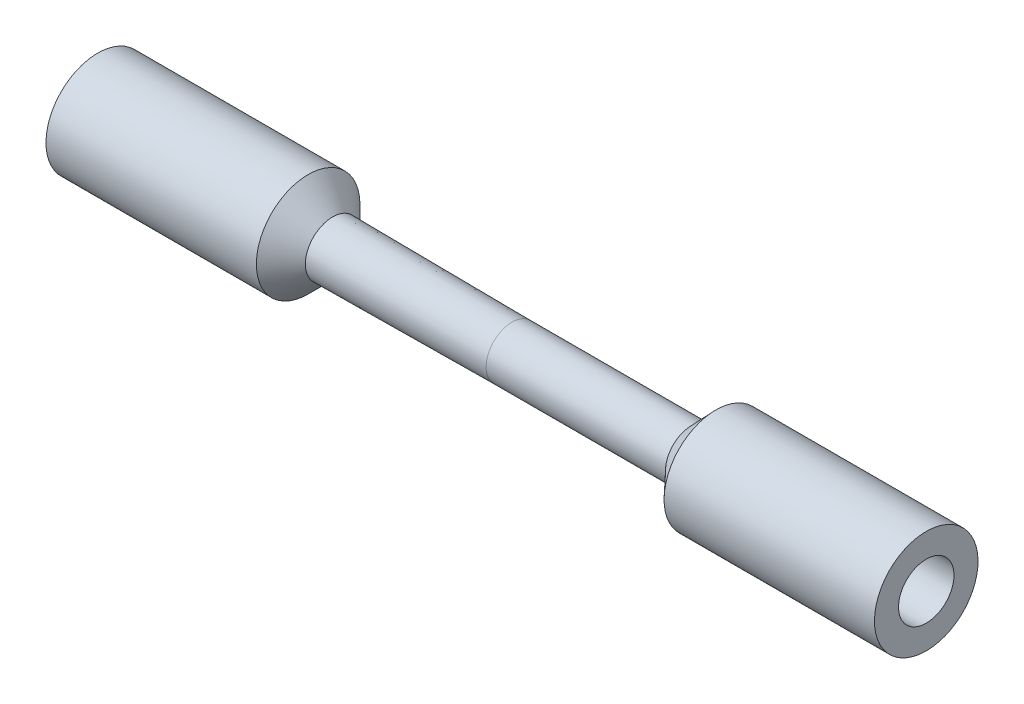
ISO-10303-21;
HEADER;
FILE_DESCRIPTION(('STEP AP214'),'2;1');
FILE_NAME('part.step','',(''),(''),'','','');
FILE_SCHEMA(('AUTOMOTIVE_DESIGN { 1 0 10303 214 1 1 1 1 }'));
ENDSEC;
DATA;
#1=APPLICATION_CONTEXT('core data for automotive mechanical design processes');
#2=APPLICATION_PROTOCOL_DEFINITION('international standard','automotive_design',2000,#1);
#3=PRODUCT_CONTEXT('',#1,'mechanical');
#4=PRODUCT('Part','Part','',(#3));
#5=PRODUCT_RELATED_PRODUCT_CATEGORY('part','',(#4));
#6=PRODUCT_DEFINITION_FORMATION('','',#4);
#7=PRODUCT_DEFINITION_CONTEXT('part definition',#1,'design');
#8=PRODUCT_DEFINITION('design','',#6,#7);
#9=PRODUCT_DEFINITION_SHAPE('','',#8);
#10=(LENGTH_UNIT() NAMED_UNIT(*) SI_UNIT(.MILLI.,.METRE.));
#11=(NAMED_UNIT(*) PLANE_ANGLE_UNIT() SI_UNIT($,.RADIAN.));
#12=(NAMED_UNIT(*) SI_UNIT($,.STERADIAN.) SOLID_ANGLE_UNIT());
#13=UNCERTAINTY_MEASURE_WITH_UNIT(LENGTH_MEASURE(1.E-05),#10,'distance_accuracy_value','');
#14=(GEOMETRIC_REPRESENTATION_CONTEXT(3) GLOBAL_UNCERTAINTY_ASSIGNED_CONTEXT((#13)) GLOBAL_UNIT_ASSIGNED_CONTEXT((#10,
#11,#12)) REPRESENTATION_CONTEXT('',''));
#15=CARTESIAN_POINT('',(0.,0.,0.));
#16=DIRECTION('',(0.,0.,1.));
#17=DIRECTION('',(1.,0.,0.));
#18=AXIS2_PLACEMENT_3D('',#15,#16,#17);
#19=CARTESIAN_POINT('',(0.,3.175,0.));
#20=DIRECTION('',(-1.,0.,0.));
#21=DIRECTION('',(0.,-1.,0.));
#22=AXIS2_PLACEMENT_3D('',#19,#20,#21);
#23=CYLINDRICAL_SURFACE('',#22,3.175);
#24=CARTESIAN_POINT('',(12.9003480324922,3.175,0.));
#25=DIRECTION('',(-1.,0.,0.));
#26=DIRECTION('',(0.,-1.,0.));
#27=AXIS2_PLACEMENT_3D('',#24,#25,#26);
#28=CIRCLE('',#27,3.175);
#29=CARTESIAN_POINT('',(12.9003480324922,0.,0.));
#30=VERTEX_POINT('',#29);
#31=EDGE_CURVE('E68',#30,#30,#28,.T.);
#32=ORIENTED_EDGE('',*,*,#31,.T.);
#33=EDGE_LOOP('',(#32));
#34=FACE_BOUND('',#33,.T.);
#35=CARTESIAN_POINT('',(0.,3.175,0.));
#36=DIRECTION('',(-1.,0.,0.));
#37=DIRECTION('',(0.,-1.,0.));
#38=AXIS2_PLACEMENT_3D('',#35,#36,#37);
#39=CIRCLE('',#38,3.175);
#40=CARTESIAN_POINT('',(0.,0.,0.));
#41=VERTEX_POINT('',#40);
#42=EDGE_CURVE('E11',#41,#41,#39,.T.);
#43=ORIENTED_EDGE('',*,*,#42,.F.);
#44=EDGE_LOOP('',(#43));
#45=FACE_BOUND('',#44,.T.);
#46=ADVANCED_FACE('F34',(#34,#45),#23,.T.);
#47=CARTESIAN_POINT('',(0.,0.,0.));
#48=DIRECTION('',(-1.,0.,0.));
#49=DIRECTION('',(0.,-1.,0.));
#50=AXIS2_PLACEMENT_3D('',#47,#48,#49);
#51=PLANE('',#50);
#52=CARTESIAN_POINT('',(0.,3.175,0.));
#53=DIRECTION('',(-1.,0.,0.));
#54=DIRECTION('',(0.,0.,1.));
#55=AXIS2_PLACEMENT_3D('',#52,#53,#54);
#56=CIRCLE('',#55,1.69999999999999);
#57=CARTESIAN_POINT('',(0.,3.175,1.69999999999999));
#58=VERTEX_POINT('',#57);
#59=EDGE_CURVE('E57',#58,#58,#56,.T.);
#60=ORIENTED_EDGE('',*,*,#59,.F.);
#61=EDGE_LOOP('',(#60));
#62=FACE_BOUND('',#61,.T.);
#63=ORIENTED_EDGE('',*,*,#42,.T.);
#64=EDGE_LOOP('',(#63));
#65=FACE_BOUND('',#64,.T.);
#66=ADVANCED_FACE('F90',(#62,#65),#51,.T.);
#67=CARTESIAN_POINT('',(50.8,0.,0.));
#68=DIRECTION('',(1.,0.,0.));
#69=DIRECTION('',(0.,1.,0.));
#70=AXIS2_PLACEMENT_3D('',#67,#68,#69);
#71=PLANE('',#70);
#72=CARTESIAN_POINT('',(50.8,3.175,0.));
#73=DIRECTION('',(1.,0.,0.));
#74=DIRECTION('',(0.,0.,-1.));
#75=AXIS2_PLACEMENT_3D('',#72,#73,#74);
#76=CIRCLE('',#75,1.69999999999999);
#77=CARTESIAN_POINT('',(50.8,3.175,-1.69999999999999));
#78=VERTEX_POINT('',#77);
#79=EDGE_CURVE('E58',#78,#78,#76,.T.);
#80=ORIENTED_EDGE('',*,*,#79,.F.);
#81=EDGE_LOOP('',(#80));
#82=FACE_BOUND('',#81,.T.);
#83=CARTESIAN_POINT('',(50.8,3.17499999999999,0.));
#84=DIRECTION('',(-1.,0.,0.));
#85=DIRECTION('',(0.,-1.,0.));
#86=AXIS2_PLACEMENT_3D('',#83,#84,#85);
#87=CIRCLE('',#86,3.17499999999999);
#88=CARTESIAN_POINT('',(50.8,0.,0.));
#89=VERTEX_POINT('',#88);
#90=EDGE_CURVE('E41',#89,#89,#87,.T.);
#91=ORIENTED_EDGE('',*,*,#90,.F.);
#92=EDGE_LOOP('',(#91));
#93=FACE_BOUND('',#92,.T.);
#94=ADVANCED_FACE('F88',(#82,#93),#71,.T.);
#95=CARTESIAN_POINT('',(0.,3.175,0.));
#96=DIRECTION('',(-1.,0.,0.));
#97=DIRECTION('',(0.,-1.,0.));
#98=AXIS2_PLACEMENT_3D('',#95,#96,#97);
#99=CYLINDRICAL_SURFACE('',#98,3.17499999999999);
#100=ORIENTED_EDGE('',*,*,#90,.T.);
#101=EDGE_LOOP('',(#100));
#102=FACE_BOUND('',#101,.T.);
#103=CARTESIAN_POINT('',(37.8996519675078,3.17499999999999,0.));
#104=DIRECTION('',(-1.,0.,0.));
#105=DIRECTION('',(0.,-1.,0.));
#106=AXIS2_PLACEMENT_3D('',#103,#104,#105);
#107=CIRCLE('',#106,3.17499999999999);
#108=CARTESIAN_POINT('',(37.8996519675078,0.,0.));
#109=VERTEX_POINT('',#108);
#110=EDGE_CURVE('E80',#109,#109,#107,.T.);
#111=ORIENTED_EDGE('',*,*,#110,.F.);
#112=EDGE_LOOP('',(#111));
#113=FACE_BOUND('',#112,.T.);
#114=ADVANCED_FACE('F85',(#102,#113),#99,.T.);
#115=CARTESIAN_POINT('',(36.4,3.17499999999999,0.));
#116=DIRECTION('',(1.,0.,0.));
#117=DIRECTION('',(0.,1.,0.));
#118=AXIS2_PLACEMENT_3D('',#115,#116,#117);
#119=CONICAL_SURFACE('',#118,1.5875,0.813846498121498);
#120=ORIENTED_EDGE('',*,*,#110,.T.);
#121=EDGE_LOOP('',(#120));
#122=FACE_BOUND('',#121,.T.);
#123=CARTESIAN_POINT('',(36.4,3.17499999999999,0.));
#124=DIRECTION('',(-1.,0.,0.));
#125=DIRECTION('',(0.,-1.,0.));
#126=AXIS2_PLACEMENT_3D('',#123,#124,#125);
#127=CIRCLE('',#126,1.5875);
#128=CARTESIAN_POINT('',(36.4,1.5875,0.));
#129=VERTEX_POINT('',#128);
#130=EDGE_CURVE('E77',#129,#129,#127,.T.);
#131=ORIENTED_EDGE('',*,*,#130,.F.);
#132=EDGE_LOOP('',(#131));
#133=FACE_BOUND('',#132,.T.);
#134=ADVANCED_FACE('F97',(#122,#133),#119,.T.);
#135=CARTESIAN_POINT('',(0.,3.175,0.));
#136=DIRECTION('',(-1.,0.,0.));
#137=DIRECTION('',(0.,-1.,0.));
#138=AXIS2_PLACEMENT_3D('',#135,#136,#137);
#139=CYLINDRICAL_SURFACE('',#138,1.5875);
#140=ORIENTED_EDGE('',*,*,#130,.T.);
#141=EDGE_LOOP('',(#140));
#142=FACE_BOUND('',#141,.T.);
#143=CARTESIAN_POINT('',(25.4,3.175,0.));
#144=DIRECTION('',(-1.,0.,0.));
#145=DIRECTION('',(0.,-1.,0.));
#146=AXIS2_PLACEMENT_3D('',#143,#144,#145);
#147=CIRCLE('',#146,1.5875);
#148=CARTESIAN_POINT('',(25.4,1.5875,0.));
#149=VERTEX_POINT('',#148);
#150=EDGE_CURVE('E74',#149,#149,#147,.T.);
#151=ORIENTED_EDGE('',*,*,#150,.F.);
#152=EDGE_LOOP('',(#151));
#153=FACE_BOUND('',#152,.T.);
#154=ADVANCED_FACE('F121',(#142,#153),#139,.T.);
#155=CARTESIAN_POINT('',(14.4003480169922,3.175,0.));
#156=DIRECTION('',(-1.,0.,0.));
#157=DIRECTION('',(0.,-1.,0.));
#158=AXIS2_PLACEMENT_3D('',#155,#156,#157);
#159=CONICAL_SURFACE('',#158,1.67500001549999,0.00795463075310564);
#160=ORIENTED_EDGE('',*,*,#150,.T.);
#161=EDGE_LOOP('',(#160));
#162=FACE_BOUND('',#161,.T.);
#163=CARTESIAN_POINT('',(14.4003480169922,3.175,0.));
#164=DIRECTION('',(-1.,0.,0.));
#165=DIRECTION('',(0.,-1.,0.));
#166=AXIS2_PLACEMENT_3D('',#163,#164,#165);
#167=CIRCLE('',#166,1.67500001549999);
#168=CARTESIAN_POINT('',(14.4003480169922,1.49999998450001,0.));
#169=VERTEX_POINT('',#168);
#170=EDGE_CURVE('E71',#169,#169,#167,.T.);
#171=ORIENTED_EDGE('',*,*,#170,.F.);
#172=EDGE_LOOP('',(#171));
#173=FACE_BOUND('',#172,.T.);
#174=ADVANCED_FACE('F113',(#162,#173),#159,.T.);
#175=CARTESIAN_POINT('',(12.9003480324922,3.175,0.));
#176=DIRECTION('',(-1.,0.,0.));
#177=DIRECTION('',(0.,-1.,0.));
#178=AXIS2_PLACEMENT_3D('',#175,#176,#177);
#179=CONICAL_SURFACE('',#178,3.175,0.785398163397454);
#180=ORIENTED_EDGE('',*,*,#170,.T.);
#181=EDGE_LOOP('',(#180));
#182=FACE_BOUND('',#181,.T.);
#183=ORIENTED_EDGE('',*,*,#31,.F.);
#184=EDGE_LOOP('',(#183));
#185=FACE_BOUND('',#184,.T.);
#186=ADVANCED_FACE('F110',(#182,#185),#179,.T.);
#187=CARTESIAN_POINT('',(6.35,3.175,0.));
#188=DIRECTION('',(-1.,0.,0.));
#189=DIRECTION('',(0.,0.,1.));
#190=AXIS2_PLACEMENT_3D('',#187,#188,#189);
#191=CONICAL_SURFACE('',#190,1.7,1.02974425867665);
#192=CARTESIAN_POINT('',(7.37146305234685,3.175,0.));
#193=VERTEX_POINT('',#192);
#194=VERTEX_LOOP('',#193);
#195=FACE_BOUND('',#194,.T.);
#196=CARTESIAN_POINT('',(6.35,3.175,0.));
#197=DIRECTION('',(-1.,0.,0.));
#198=DIRECTION('',(0.,0.,1.));
#199=AXIS2_PLACEMENT_3D('',#196,#197,#198);
#200=CIRCLE('',#199,1.7);
#201=CARTESIAN_POINT('',(6.35,3.175,1.7));
#202=VERTEX_POINT('',#201);
#203=EDGE_CURVE('E61',#202,#202,#200,.T.);
#204=ORIENTED_EDGE('',*,*,#203,.T.);
#205=EDGE_LOOP('',(#204));
#206=FACE_BOUND('',#205,.T.);
#207=ADVANCED_FACE('F112',(#195,#206),#191,.F.);
#208=CARTESIAN_POINT('',(0.,3.175,0.));
#209=DIRECTION('',(-1.,0.,0.));
#210=DIRECTION('',(0.,0.,1.));
#211=AXIS2_PLACEMENT_3D('',#208,#209,#210);
#212=CYLINDRICAL_SURFACE('',#211,1.69999999999999);
#213=ORIENTED_EDGE('',*,*,#203,.F.);
#214=EDGE_LOOP('',(#213));
#215=FACE_BOUND('',#214,.T.);
#216=ORIENTED_EDGE('',*,*,#59,.T.);
#217=EDGE_LOOP('',(#216));
#218=FACE_BOUND('',#217,.T.);
#219=ADVANCED_FACE('F51',(#215,#218),#212,.F.);
#220=CARTESIAN_POINT('',(44.45,3.175,0.));
#221=DIRECTION('',(1.,0.,0.));
#222=DIRECTION('',(0.,0.,-1.));
#223=AXIS2_PLACEMENT_3D('',#220,#221,#222);
#224=CONICAL_SURFACE('',#223,1.7,1.02974425867665);
#225=CARTESIAN_POINT('',(43.4285369476531,3.175,0.));
#226=VERTEX_POINT('',#225);
#227=VERTEX_LOOP('',#226);
#228=FACE_BOUND('',#227,.T.);
#229=CARTESIAN_POINT('',(44.45,3.175,0.));
#230=DIRECTION('',(1.,0.,0.));
#231=DIRECTION('',(0.,0.,-1.));
#232=AXIS2_PLACEMENT_3D('',#229,#230,#231);
#233=CIRCLE('',#232,1.7);
#234=CARTESIAN_POINT('',(44.45,3.175,-1.7));
#235=VERTEX_POINT('',#234);
#236=EDGE_CURVE('E55',#235,#235,#233,.T.);
#237=ORIENTED_EDGE('',*,*,#236,.T.);
#238=EDGE_LOOP('',(#237));
#239=FACE_BOUND('',#238,.T.);
#240=ADVANCED_FACE('F47',(#228,#239),#224,.F.);
#241=CARTESIAN_POINT('',(50.8,3.175,0.));
#242=DIRECTION('',(1.,0.,0.));
#243=DIRECTION('',(0.,0.,-1.));
#244=AXIS2_PLACEMENT_3D('',#241,#242,#243);
#245=CYLINDRICAL_SURFACE('',#244,1.69999999999999);
#246=ORIENTED_EDGE('',*,*,#236,.F.);
#247=EDGE_LOOP('',(#246));
#248=FACE_BOUND('',#247,.T.);
#249=ORIENTED_EDGE('',*,*,#79,.T.);
#250=EDGE_LOOP('',(#249));
#251=FACE_BOUND('',#250,.T.);
#252=ADVANCED_FACE('F50',(#248,#251),#245,.F.);
#253=CLOSED_SHELL('',(#46,#66,#94,#114,#134,#154,#174,#186,#207,#219,#240,#252));
#254=MANIFOLD_SOLID_BREP('B2',#253);
#255=ADVANCED_BREP_SHAPE_REPRESENTATION('',(#18,#254),#14);
#256=SHAPE_DEFINITION_REPRESENTATION(#9,#255);
ENDSEC;
END-ISO-10303-21;
